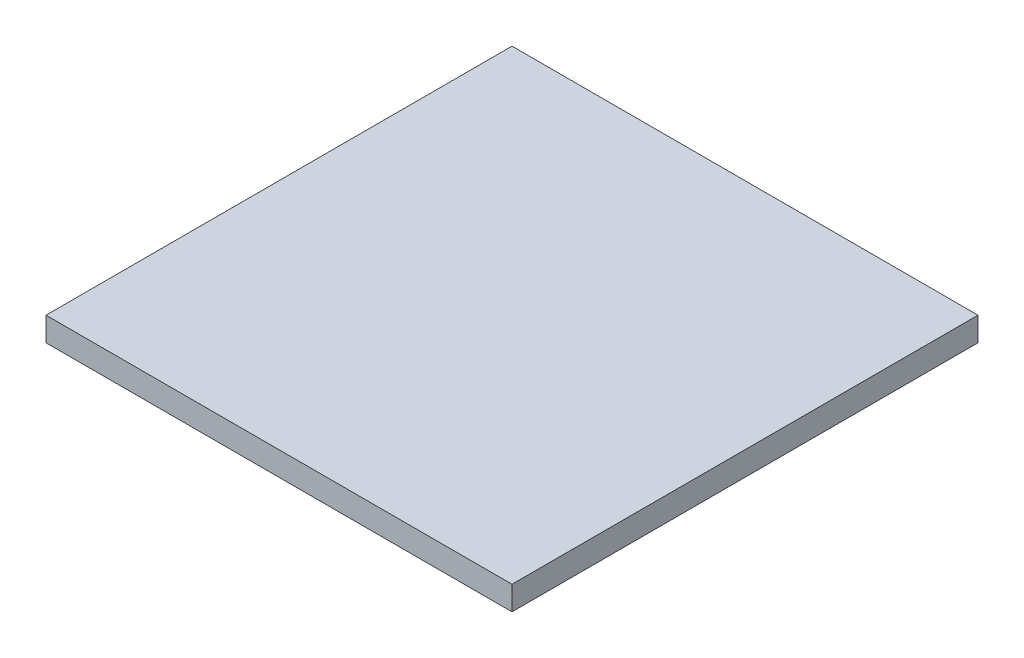
ISO-10303-21;
HEADER;
FILE_DESCRIPTION(('STEP AP214'),'2;1');
FILE_NAME('part.step','',(''),(''),'','','');
FILE_SCHEMA(('AUTOMOTIVE_DESIGN { 1 0 10303 214 1 1 1 1 }'));
ENDSEC;
DATA;
#1=APPLICATION_CONTEXT('core data for automotive mechanical design processes');
#2=APPLICATION_PROTOCOL_DEFINITION('international standard','automotive_design',2000,#1);
#3=PRODUCT_CONTEXT('',#1,'mechanical');
#4=PRODUCT('Part','Part','',(#3));
#5=PRODUCT_RELATED_PRODUCT_CATEGORY('part','',(#4));
#6=PRODUCT_DEFINITION_FORMATION('','',#4);
#7=PRODUCT_DEFINITION_CONTEXT('part definition',#1,'design');
#8=PRODUCT_DEFINITION('design','',#6,#7);
#9=PRODUCT_DEFINITION_SHAPE('','',#8);
#10=(LENGTH_UNIT() NAMED_UNIT(*) SI_UNIT(.MILLI.,.METRE.));
#11=(NAMED_UNIT(*) PLANE_ANGLE_UNIT() SI_UNIT($,.RADIAN.));
#12=(NAMED_UNIT(*) SI_UNIT($,.STERADIAN.) SOLID_ANGLE_UNIT());
#13=UNCERTAINTY_MEASURE_WITH_UNIT(LENGTH_MEASURE(1.E-05),#10,'distance_accuracy_value','');
#14=(GEOMETRIC_REPRESENTATION_CONTEXT(3) GLOBAL_UNCERTAINTY_ASSIGNED_CONTEXT((#13)) GLOBAL_UNIT_ASSIGNED_CONTEXT((#10,
#11,#12)) REPRESENTATION_CONTEXT('',''));
#15=CARTESIAN_POINT('',(0.,0.,0.));
#16=DIRECTION('',(0.,0.,1.));
#17=DIRECTION('',(1.,0.,0.));
#18=AXIS2_PLACEMENT_3D('',#15,#16,#17);
#19=CARTESIAN_POINT('',(177.8,18.25625,-177.8));
#20=DIRECTION('',(-1.,0.,0.));
#21=DIRECTION('',(0.,0.,1.));
#22=AXIS2_PLACEMENT_3D('',#19,#20,#21);
#23=PLANE('',#22);
#24=DIRECTION('',(0.,0.,-1.));
#25=VECTOR('',#24,1.);
#26=CARTESIAN_POINT('',(177.8,0.,-177.8));
#27=LINE('',#26,#25);
#28=CARTESIAN_POINT('',(177.8,0.,177.8));
#29=VERTEX_POINT('',#28);
#30=CARTESIAN_POINT('',(177.8,0.,-177.8));
#31=VERTEX_POINT('',#30);
#32=EDGE_CURVE('E93',#29,#31,#27,.T.);
#33=ORIENTED_EDGE('',*,*,#32,.T.);
#34=DIRECTION('',(0.,-1.,0.));
#35=VECTOR('',#34,1.);
#36=CARTESIAN_POINT('',(177.8,18.25625,-177.8));
#37=LINE('',#36,#35);
#38=CARTESIAN_POINT('',(177.8,18.25625,-177.8));
#39=VERTEX_POINT('',#38);
#40=EDGE_CURVE('E11',#39,#31,#37,.T.);
#41=ORIENTED_EDGE('',*,*,#40,.F.);
#42=DIRECTION('',(0.,0.,-1.));
#43=VECTOR('',#42,1.);
#44=CARTESIAN_POINT('',(177.8,18.25625,-177.8));
#45=LINE('',#44,#43);
#46=CARTESIAN_POINT('',(177.8,18.25625,177.8));
#47=VERTEX_POINT('',#46);
#48=EDGE_CURVE('E81',#47,#39,#45,.T.);
#49=ORIENTED_EDGE('',*,*,#48,.F.);
#50=DIRECTION('',(0.,-1.,0.));
#51=VECTOR('',#50,1.);
#52=CARTESIAN_POINT('',(177.8,18.25625,177.8));
#53=LINE('',#52,#51);
#54=EDGE_CURVE('E89',#47,#29,#53,.T.);
#55=ORIENTED_EDGE('',*,*,#54,.T.);
#56=EDGE_LOOP('',(#33,#41,#49,#55));
#57=FACE_BOUND('',#56,.T.);
#58=ADVANCED_FACE('F30',(#57),#23,.F.);
#59=CARTESIAN_POINT('',(-177.8,18.25625,-177.8));
#60=DIRECTION('',(0.,0.,1.));
#61=DIRECTION('',(1.,0.,0.));
#62=AXIS2_PLACEMENT_3D('',#59,#60,#61);
#63=PLANE('',#62);
#64=DIRECTION('',(-1.,0.,0.));
#65=VECTOR('',#64,1.);
#66=CARTESIAN_POINT('',(-177.8,0.,-177.8));
#67=LINE('',#66,#65);
#68=CARTESIAN_POINT('',(-177.8,0.,-177.8));
#69=VERTEX_POINT('',#68);
#70=EDGE_CURVE('E85',#31,#69,#67,.T.);
#71=ORIENTED_EDGE('',*,*,#70,.T.);
#72=DIRECTION('',(0.,-1.,0.));
#73=VECTOR('',#72,1.);
#74=CARTESIAN_POINT('',(-177.8,18.25625,-177.8));
#75=LINE('',#74,#73);
#76=CARTESIAN_POINT('',(-177.8,18.25625,-177.8));
#77=VERTEX_POINT('',#76);
#78=EDGE_CURVE('E38',#77,#69,#75,.T.);
#79=ORIENTED_EDGE('',*,*,#78,.F.);
#80=DIRECTION('',(-1.,0.,0.));
#81=VECTOR('',#80,1.);
#82=CARTESIAN_POINT('',(-177.8,18.25625,-177.8));
#83=LINE('',#82,#81);
#84=EDGE_CURVE('E76',#39,#77,#83,.T.);
#85=ORIENTED_EDGE('',*,*,#84,.F.);
#86=ORIENTED_EDGE('',*,*,#40,.T.);
#87=EDGE_LOOP('',(#71,#79,#85,#86));
#88=FACE_BOUND('',#87,.T.);
#89=ADVANCED_FACE('F84',(#88),#63,.F.);
#90=CARTESIAN_POINT('',(-177.8,18.25625,-177.8));
#91=DIRECTION('',(1.,0.,0.));
#92=DIRECTION('',(0.,0.,-1.));
#93=AXIS2_PLACEMENT_3D('',#90,#91,#92);
#94=PLANE('',#93);
#95=DIRECTION('',(0.,0.,1.));
#96=VECTOR('',#95,1.);
#97=CARTESIAN_POINT('',(-177.8,0.,-177.8));
#98=LINE('',#97,#96);
#99=CARTESIAN_POINT('',(-177.8,0.,177.8));
#100=VERTEX_POINT('',#99);
#101=EDGE_CURVE('E63',#69,#100,#98,.T.);
#102=ORIENTED_EDGE('',*,*,#101,.T.);
#103=DIRECTION('',(0.,-1.,0.));
#104=VECTOR('',#103,1.);
#105=CARTESIAN_POINT('',(-177.8,18.25625,177.8));
#106=LINE('',#105,#104);
#107=CARTESIAN_POINT('',(-177.8,18.25625,177.8));
#108=VERTEX_POINT('',#107);
#109=EDGE_CURVE('E86',#108,#100,#106,.T.);
#110=ORIENTED_EDGE('',*,*,#109,.F.);
#111=DIRECTION('',(0.,0.,1.));
#112=VECTOR('',#111,1.);
#113=CARTESIAN_POINT('',(-177.8,18.25625,-177.8));
#114=LINE('',#113,#112);
#115=EDGE_CURVE('E79',#77,#108,#114,.T.);
#116=ORIENTED_EDGE('',*,*,#115,.F.);
#117=ORIENTED_EDGE('',*,*,#78,.T.);
#118=EDGE_LOOP('',(#102,#110,#116,#117));
#119=FACE_BOUND('',#118,.T.);
#120=ADVANCED_FACE('F87',(#119),#94,.F.);
#121=CARTESIAN_POINT('',(-177.8,18.25625,177.8));
#122=DIRECTION('',(0.,0.,-1.));
#123=DIRECTION('',(-1.,0.,0.));
#124=AXIS2_PLACEMENT_3D('',#121,#122,#123);
#125=PLANE('',#124);
#126=DIRECTION('',(1.,0.,0.));
#127=VECTOR('',#126,1.);
#128=CARTESIAN_POINT('',(-177.8,0.,177.8));
#129=LINE('',#128,#127);
#130=EDGE_CURVE('E69',#100,#29,#129,.T.);
#131=ORIENTED_EDGE('',*,*,#130,.T.);
#132=ORIENTED_EDGE('',*,*,#54,.F.);
#133=DIRECTION('',(1.,0.,0.));
#134=VECTOR('',#133,1.);
#135=CARTESIAN_POINT('',(-177.8,18.25625,177.8));
#136=LINE('',#135,#134);
#137=EDGE_CURVE('E46',#108,#47,#136,.T.);
#138=ORIENTED_EDGE('',*,*,#137,.F.);
#139=ORIENTED_EDGE('',*,*,#109,.T.);
#140=EDGE_LOOP('',(#131,#132,#138,#139));
#141=FACE_BOUND('',#140,.T.);
#142=ADVANCED_FACE('F100',(#141),#125,.F.);
#143=CARTESIAN_POINT('',(0.,18.25625,0.));
#144=DIRECTION('',(0.,1.,0.));
#145=DIRECTION('',(0.,0.,1.));
#146=AXIS2_PLACEMENT_3D('',#143,#144,#145);
#147=PLANE('',#146);
#148=ORIENTED_EDGE('',*,*,#48,.T.);
#149=ORIENTED_EDGE('',*,*,#84,.T.);
#150=ORIENTED_EDGE('',*,*,#115,.T.);
#151=ORIENTED_EDGE('',*,*,#137,.T.);
#152=EDGE_LOOP('',(#148,#149,#150,#151));
#153=FACE_BOUND('',#152,.T.);
#154=ADVANCED_FACE('F77',(#153),#147,.T.);
#155=CARTESIAN_POINT('',(0.,0.,0.));
#156=DIRECTION('',(0.,1.,0.));
#157=DIRECTION('',(0.,0.,1.));
#158=AXIS2_PLACEMENT_3D('',#155,#156,#157);
#159=PLANE('',#158);
#160=ORIENTED_EDGE('',*,*,#32,.F.);
#161=ORIENTED_EDGE('',*,*,#130,.F.);
#162=ORIENTED_EDGE('',*,*,#101,.F.);
#163=ORIENTED_EDGE('',*,*,#70,.F.);
#164=EDGE_LOOP('',(#160,#161,#162,#163));
#165=FACE_BOUND('',#164,.T.);
#166=ADVANCED_FACE('F103',(#165),#159,.F.);
#167=CLOSED_SHELL('',(#58,#89,#120,#142,#154,#166));
#168=MANIFOLD_SOLID_BREP('B2',#167);
#169=ADVANCED_BREP_SHAPE_REPRESENTATION('',(#18,#168),#14);
#170=SHAPE_DEFINITION_REPRESENTATION(#9,#169);
ENDSEC;
END-ISO-10303-21;
